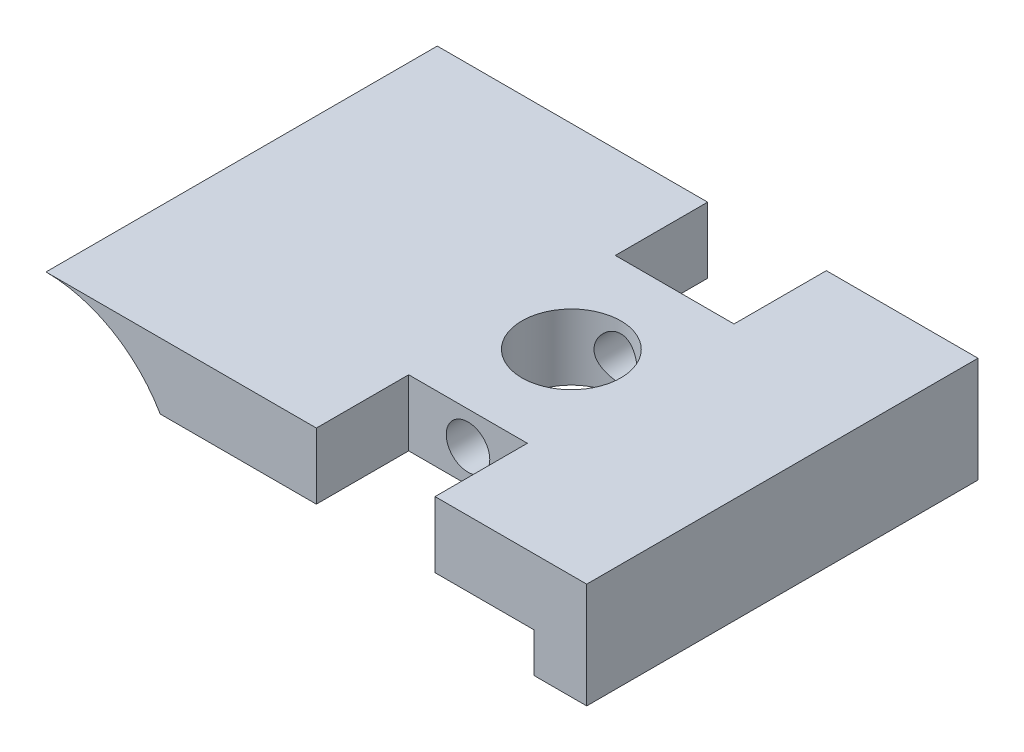
ISO-10303-21;
HEADER;
FILE_DESCRIPTION(('STEP AP214'),'2;1');
FILE_NAME('part.step','',(''),(''),'','','');
FILE_SCHEMA(('AUTOMOTIVE_DESIGN { 1 0 10303 214 1 1 1 1 }'));
ENDSEC;
DATA;
#1=APPLICATION_CONTEXT('core data for automotive mechanical design processes');
#2=APPLICATION_PROTOCOL_DEFINITION('international standard','automotive_design',2000,#1);
#3=PRODUCT_CONTEXT('',#1,'mechanical');
#4=PRODUCT('Part','Part','',(#3));
#5=PRODUCT_RELATED_PRODUCT_CATEGORY('part','',(#4));
#6=PRODUCT_DEFINITION_FORMATION('','',#4);
#7=PRODUCT_DEFINITION_CONTEXT('part definition',#1,'design');
#8=PRODUCT_DEFINITION('design','',#6,#7);
#9=PRODUCT_DEFINITION_SHAPE('','',#8);
#10=(LENGTH_UNIT() NAMED_UNIT(*) SI_UNIT(.MILLI.,.METRE.));
#11=(NAMED_UNIT(*) PLANE_ANGLE_UNIT() SI_UNIT($,.RADIAN.));
#12=(NAMED_UNIT(*) SI_UNIT($,.STERADIAN.) SOLID_ANGLE_UNIT());
#13=UNCERTAINTY_MEASURE_WITH_UNIT(LENGTH_MEASURE(1.E-05),#10,'distance_accuracy_value','');
#14=(GEOMETRIC_REPRESENTATION_CONTEXT(3) GLOBAL_UNCERTAINTY_ASSIGNED_CONTEXT((#13)) GLOBAL_UNIT_ASSIGNED_CONTEXT((#10,
#11,#12)) REPRESENTATION_CONTEXT('',''));
#15=CARTESIAN_POINT('',(0.,0.,0.));
#16=DIRECTION('',(0.,0.,1.));
#17=DIRECTION('',(1.,0.,0.));
#18=AXIS2_PLACEMENT_3D('',#15,#16,#17);
#19=CARTESIAN_POINT('',(4.5,0.,-14.836));
#20=DIRECTION('',(0.,0.,1.));
#21=DIRECTION('',(1.,0.,0.));
#22=AXIS2_PLACEMENT_3D('',#19,#20,#21);
#23=CYLINDRICAL_SURFACE('',#22,1.65);
#24=CARTESIAN_POINT('',(6.15,0.,-3.36749164809655));
#25=CARTESIAN_POINT('',(6.14999591948725,-0.0874743691332474,-3.36749607292385));
#26=CARTESIAN_POINT('',(6.14299960015496,-0.175092773934513,-3.37094939684784));
#27=CARTESIAN_POINT('',(6.11531716545798,-0.34775711686567,-3.38429832583538));
#28=CARTESIAN_POINT('',(6.09459592274657,-0.432795867086391,-3.39421046041475));
#29=CARTESIAN_POINT('',(6.04044870220548,-0.597493099250677,-3.41912171212208));
#30=CARTESIAN_POINT('',(6.00707857419381,-0.677173445386291,-3.43409843617774));
#31=CARTESIAN_POINT('',(5.92874832845569,-0.829783884986518,-3.46741736925901));
#32=CARTESIAN_POINT('',(5.88379002894349,-0.902715034980067,-3.48575905018412));
#33=CARTESIAN_POINT('',(5.78021734567749,-1.04487154765316,-3.52516638479344));
#34=CARTESIAN_POINT('',(5.72091990046757,-1.11357209474115,-3.5463309106205));
#35=CARTESIAN_POINT('',(5.59178303274802,-1.240446840094,-3.5881911575404));
#36=CARTESIAN_POINT('',(5.52193928529622,-1.2986166981996,-3.60888668227713));
#37=CARTESIAN_POINT('',(5.36946484491626,-1.4055670834385,-3.64870271327509));
#38=CARTESIAN_POINT('',(5.28637319615618,-1.45374252984987,-3.66769507829857));
#39=CARTESIAN_POINT('',(5.11227632392995,-1.53520034882065,-3.700736202455));
#40=CARTESIAN_POINT('',(5.02127502438019,-1.56849005628031,-3.71478739560396));
#41=CARTESIAN_POINT('',(4.8394662745173,-1.61728382118505,-3.73565913311448));
#42=CARTESIAN_POINT('',(4.74894589824285,-1.63369687425849,-3.74284752867496));
#43=CARTESIAN_POINT('',(4.56617018053507,-1.65122350001049,-3.75052967187645));
#44=CARTESIAN_POINT('',(4.47391564874559,-1.65234404312535,-3.75102646959465));
#45=CARTESIAN_POINT('',(4.29695735459994,-1.63969762210197,-3.74547519866295));
#46=CARTESIAN_POINT('',(4.2121653497081,-1.62693375012661,-3.739868091581));
#47=CARTESIAN_POINT('',(4.0460705321449,-1.58862001141632,-3.72336083389609));
#48=CARTESIAN_POINT('',(3.96476797823857,-1.56306919822084,-3.71246029148675));
#49=CARTESIAN_POINT('',(3.80645273442336,-1.49962622377596,-3.68619520386884));
#50=CARTESIAN_POINT('',(3.72952453920683,-1.46155151512837,-3.67076501619212));
#51=CARTESIAN_POINT('',(3.58294686925941,-1.37433410623967,-3.63691910801703));
#52=CARTESIAN_POINT('',(3.51330005270581,-1.32518738450649,-3.6185023034251));
#53=CARTESIAN_POINT('',(3.37753504589473,-1.2128170119971,-3.57882020061428));
#54=CARTESIAN_POINT('',(3.31210572269681,-1.14879890575555,-3.5574447595915));
#55=CARTESIAN_POINT('',(3.19259260075723,-1.01070787762529,-3.51528240579217));
#56=CARTESIAN_POINT('',(3.13851423294623,-0.936630170451263,-3.49449577883282));
#57=CARTESIAN_POINT('',(3.04117220405856,-0.776800460066403,-3.45502479534648));
#58=CARTESIAN_POINT('',(2.99843008891747,-0.690699088400845,-3.43645839327868));
#59=CARTESIAN_POINT('',(2.92834028609235,-0.511490455495734,-3.40497856582965));
#60=CARTESIAN_POINT('',(2.90098013157646,-0.41838893735563,-3.39206056440346));
#61=CARTESIAN_POINT('',(2.86429227707905,-0.234744535363264,-3.37451456223478));
#62=CARTESIAN_POINT('',(2.85383875555708,-0.144476988157731,-3.36937064835985));
#63=CARTESIAN_POINT('',(2.84792333452705,0.0366498278836367,-3.3664757487194));
#64=CARTESIAN_POINT('',(2.85245516573099,0.127508833402344,-3.36872167133214));
#65=CARTESIAN_POINT('',(2.87535174013094,0.300038323378435,-3.37981562096985));
#66=CARTESIAN_POINT('',(2.89265374352297,0.381886932345065,-3.3881559621082));
#67=CARTESIAN_POINT('',(2.93914744636585,0.541431160999625,-3.40982287754369));
#68=CARTESIAN_POINT('',(2.96834214737761,0.619125726657321,-3.42315071054923));
#69=CARTESIAN_POINT('',(3.03921629690324,0.77202746384104,-3.45400682275722));
#70=CARTESIAN_POINT('',(3.08139272921155,0.846970827739317,-3.47169539316014));
#71=CARTESIAN_POINT('',(3.1765572613445,0.989101543315069,-3.50907546279441));
#72=CARTESIAN_POINT('',(3.22955038819797,1.05628526590526,-3.5287678911715));
#73=CARTESIAN_POINT('',(3.35062358980462,1.1874847750961,-3.57013856276202));
#74=CARTESIAN_POINT('',(3.4196470398001,1.25062896923802,-3.59183160476859));
#75=CARTESIAN_POINT('',(3.56778238636593,1.36462621623266,-3.63309467060809));
#76=CARTESIAN_POINT('',(3.64689558402024,1.41547768147164,-3.65266442003673));
#77=CARTESIAN_POINT('',(3.81400673932618,1.50362813045693,-3.68771558350776));
#78=CARTESIAN_POINT('',(3.90206664806588,1.54082304607771,-3.70316536765515));
#79=CARTESIAN_POINT('',(4.08405684732281,1.59956776607056,-3.72798894821772));
#80=CARTESIAN_POINT('',(4.17798315090971,1.62112807306507,-3.73736682301229));
#81=CARTESIAN_POINT('',(4.3612978165453,1.64656089333973,-3.74847245839303));
#82=CARTESIAN_POINT('',(4.45048512527526,1.65165818539735,-3.75072963755332));
#83=CARTESIAN_POINT('',(4.62843486064658,1.64739798838614,-3.74885512685435));
#84=CARTESIAN_POINT('',(4.71719737386056,1.63804358240264,-3.74472479968784));
#85=CARTESIAN_POINT('',(4.88782932587363,1.60602123171462,-3.7308324127445));
#86=CARTESIAN_POINT('',(4.96983114363675,1.58394115377816,-3.72131934376771));
#87=CARTESIAN_POINT('',(5.12890956243099,1.52777362465028,-3.69776205916142));
#88=CARTESIAN_POINT('',(5.20598528433432,1.49368403723099,-3.68371703743449));
#89=CARTESIAN_POINT('',(5.3569304617613,1.41274147649752,-3.65162935021383));
#90=CARTESIAN_POINT('',(5.43049119711801,1.3653752637279,-3.63343300227536));
#91=CARTESIAN_POINT('',(5.56894266820481,1.2599369507724,-3.59513976322225));
#92=CARTESIAN_POINT('',(5.63382977719906,1.20186039623366,-3.57504208305736));
#93=CARTESIAN_POINT('',(5.75831260974056,1.0713970399496,-3.53324031823005));
#94=CARTESIAN_POINT('',(5.81711532685678,0.998252385431571,-3.51153178279635));
#95=CARTESIAN_POINT('',(5.92177534917193,0.842529476107367,-3.47047923678989));
#96=CARTESIAN_POINT('',(5.96762474174624,0.759945498298501,-3.45113667556083));
#97=CARTESIAN_POINT('',(6.0449162136947,0.587124299309065,-3.41723991894322));
#98=CARTESIAN_POINT('',(6.07632700235197,0.496870953906527,-3.40269614232787));
#99=CARTESIAN_POINT('',(6.12309555077018,0.311643517725808,-3.38064338773551));
#100=CARTESIAN_POINT('',(6.1385071714776,0.216686400884626,-3.3731108155642));
#101=CARTESIAN_POINT('',(6.14703108329939,0.100998496777638,-3.36894448238601));
#102=CARTESIAN_POINT('',(6.14814335262455,0.0808209970433201,-3.36840080987488));
#103=CARTESIAN_POINT('',(6.14962829144477,0.0404315640214751,-3.3676738770119));
#104=CARTESIAN_POINT('',(6.15000094320723,0.0202196299199993,-3.36749062530128));
#105=CARTESIAN_POINT('',(6.15,0.,-3.36749164809655));
#106=B_SPLINE_CURVE_WITH_KNOTS('',3,(#24,#25,#26,#27,#28,#29,#30,#31,#32,#33,#34,#35,#36,#37,
#38,#39,#40,#41,#42,#43,#44,#45,#46,#47,#48,#49,#50,#51,#52,#53,#54,#55,#56,#57,#58,#59,#60,#61,
#62,#63,#64,#65,#66,#67,#68,#69,#70,#71,#72,#73,#74,#75,#76,#77,#78,#79,#80,#81,#82,#83,#84,#85,
#86,#87,#88,#89,#90,#91,#92,#93,#94,#95,#96,#97,#98,#99,#100,#101,#102,#103,#104,#105),
.UNSPECIFIED.,.T.,.F.,(4,2,2,2,2,2,2,2,2,2,2,2,2,2,2,2,2,2,2,2,2,2,2,2,2,2,2,2,2,2,2,2,2,2,2,2,
2,2,2,2,4),(0.,0.262337992001349,0.52535001551118,0.787214015160153,1.04903695265106,
1.32739302247777,1.60586355517072,1.89807751150631,2.19014732125288,2.46549872058573,
2.74072460857159,2.9973112845901,3.25391695538524,3.51444216606865,3.77506215572741,
4.05582705551463,4.336725984226,4.62890596840992,4.92084880275994,5.1924046605751,
5.46384692437079,5.71493513596501,5.96608675823259,6.22839495294345,6.49082533337074,
6.77759301230099,7.06439770769602,7.35334470453729,7.64209741960136,7.90880391080322,
8.17545351143564,8.43067328899049,8.68593848747794,8.95289970595717,9.21997220307097,
9.50762420315226,9.79545153931286,10.0838997352209,10.371373694431,10.4320114560409,
10.4926506714452),.UNSPECIFIED.);
#107=CARTESIAN_POINT('',(6.15,0.,-3.36749164809655));
#108=VERTEX_POINT('',#107);
#109=EDGE_CURVE('E189',#108,#108,#106,.T.);
#110=ORIENTED_EDGE('',*,*,#109,.F.);
#111=EDGE_LOOP('',(#110));
#112=FACE_BOUND('',#111,.T.);
#113=CARTESIAN_POINT('',(4.5,0.,-7.835));
#114=DIRECTION('',(0.,0.,1.));
#115=DIRECTION('',(1.,0.,0.));
#116=AXIS2_PLACEMENT_3D('',#113,#114,#115);
#117=CIRCLE('',#116,1.65);
#118=CARTESIAN_POINT('',(6.15,0.,-7.835));
#119=VERTEX_POINT('',#118);
#120=EDGE_CURVE('E522',#119,#119,#117,.T.);
#121=ORIENTED_EDGE('',*,*,#120,.F.);
#122=EDGE_LOOP('',(#121));
#123=FACE_BOUND('',#122,.T.);
#124=ADVANCED_FACE('F45',(#112,#123),#23,.F.);
#125=CARTESIAN_POINT('',(4.5,-1.65,3.75));
#126=CARTESIAN_POINT('',(4.58794065243915,-1.64999603822561,3.74999677525689));
#127=CARTESIAN_POINT('',(4.67602118872723,-1.64292811014754,3.7468719189208));
#128=CARTESIAN_POINT('',(4.84965330491862,-1.61493414299233,3.734683166008));
#129=CARTESIAN_POINT('',(4.93519818666942,-1.59397431770864,3.72560479056562));
#130=CARTESIAN_POINT('',(5.10097235797528,-1.5391312845056,3.70247374212791));
#131=CARTESIAN_POINT('',(5.18121929706646,-1.505293822675,3.68843868963418));
#132=CARTESIAN_POINT('',(5.33481096834596,-1.42585820871192,3.65674015300381));
#133=CARTESIAN_POINT('',(5.40815735131847,-1.38026287916687,3.63907753990429));
#134=CARTESIAN_POINT('',(5.55000163649842,-1.27598104842036,3.60078615738986));
#135=CARTESIAN_POINT('',(5.61807366426439,-1.21675391782859,3.58005322837619));
#136=CARTESIAN_POINT('',(5.7436925761984,-1.08803679555134,3.53837779505836));
#137=CARTESIAN_POINT('',(5.80123331014303,-1.01854084946946,3.51743517577732));
#138=CARTESIAN_POINT('',(5.90737198125606,-0.866527492524001,3.47638120662905));
#139=CARTESIAN_POINT('',(5.95528386928225,-0.783497192018435,3.45638307676996));
#140=CARTESIAN_POINT('',(6.03627172599083,-0.609555260312115,3.4211597332649));
#141=CARTESIAN_POINT('',(6.0693561919984,-0.518648178890967,3.40593178742375));
#142=CARTESIAN_POINT('',(6.11794121689661,-0.33643127427299,3.3831135312385));
#143=CARTESIAN_POINT('',(6.13426566626132,-0.245387501455806,3.37516767353209));
#144=CARTESIAN_POINT('',(6.15143054751148,-0.0615333461945651,3.3668053594707));
#145=CARTESIAN_POINT('',(6.15228100759649,0.0312758530848443,3.36638402671406));
#146=CARTESIAN_POINT('',(6.13908919688509,0.207355873544221,3.3728210640382));
#147=CARTESIAN_POINT('',(6.1263414186449,0.290751689794496,3.37904671722602));
#148=CARTESIAN_POINT('',(6.08850520692875,0.454071225614268,3.39699646382114));
#149=CARTESIAN_POINT('',(6.06341407162607,0.533994180841888,3.40872176101459));
#150=CARTESIAN_POINT('',(6.00110649630305,0.690226926082279,3.43662073577462));
#151=CARTESIAN_POINT('',(5.96363227970244,0.766416489003947,3.45288773136686));
#152=CARTESIAN_POINT('',(5.87780710670809,0.911743878376032,3.48802159021638));
#153=CARTESIAN_POINT('',(5.82945161231713,0.980878745156236,3.50688953691531));
#154=CARTESIAN_POINT('',(5.71783776896922,1.1170679833526,3.54728261097474));
#155=CARTESIAN_POINT('',(5.65359849475329,1.18329659100235,3.56888963165699));
#156=CARTESIAN_POINT('',(5.51473808953318,1.30433611063186,3.61082599340459));
#157=CARTESIAN_POINT('',(5.44011395212262,1.3591437047246,3.63115496199219));
#158=CARTESIAN_POINT('',(5.2798454417349,1.45719190039968,3.66896451776513));
#159=CARTESIAN_POINT('',(5.19394811565676,1.50005943159355,3.68634771561838));
#160=CARTESIAN_POINT('',(5.01519989197508,1.57043908051859,3.71554130843415));
#161=CARTESIAN_POINT('',(4.92235333017466,1.59796068385571,3.72735514522372));
#162=CARTESIAN_POINT('',(4.73921022750968,1.63505304083377,3.74341295596741));
#163=CARTESIAN_POINT('',(4.64917854061997,1.64572966452197,3.74812228788192));
#164=CARTESIAN_POINT('',(4.46849247665595,1.65217171911425,3.75095455785044));
#165=CARTESIAN_POINT('',(4.37783831540075,1.64794208106068,3.74907967398628));
#166=CARTESIAN_POINT('',(4.20390665287527,1.62544881834208,3.73925037459651));
#167=CARTESIAN_POINT('',(4.12050230959726,1.60799437581934,3.73164663418775));
#168=CARTESIAN_POINT('',(3.95791706209694,1.56071027218963,3.71151728629914));
#169=CARTESIAN_POINT('',(3.87873667607145,1.53087909662229,3.69899107649862));
#170=CARTESIAN_POINT('',(3.72404079862632,1.45873229578337,3.66971134498956));
#171=CARTESIAN_POINT('',(3.64871703627142,1.41605581574277,3.65283800179973));
#172=CARTESIAN_POINT('',(3.50602810222664,1.31982329381418,3.61662102234894));
#173=CARTESIAN_POINT('',(3.43866640117435,1.26626253496257,3.5972763164179));
#174=CARTESIAN_POINT('',(3.30819611837274,1.14484038573232,3.55628214760162));
#175=CARTESIAN_POINT('',(3.24584598439285,1.07618271743489,3.53457144282308));
#176=CARTESIAN_POINT('',(3.13330445356359,0.92909720685713,3.49260064747062));
#177=CARTESIAN_POINT('',(3.08311709508679,0.85066613259215,3.47234104026915));
#178=CARTESIAN_POINT('',(2.9954030774859,0.68392159127596,3.43526035744153));
#179=CARTESIAN_POINT('',(2.95817723591055,0.595429542818635,3.4185241503665));
#180=CARTESIAN_POINT('',(2.89950438017547,0.412456963898667,3.39145640297362));
#181=CARTESIAN_POINT('',(2.87804232181517,0.317982236816919,3.38111875766089));
#182=CARTESIAN_POINT('',(2.85307874998712,0.134229339541117,3.36902436868046));
#183=CARTESIAN_POINT('',(2.84822601990919,0.0451768053067841,3.36662264808986));
#184=CARTESIAN_POINT('',(2.85292803694661,-0.132443324028022,3.36892598901368));
#185=CARTESIAN_POINT('',(2.86247987258739,-0.221011013494954,3.37362961438419));
#186=CARTESIAN_POINT('',(2.89454415171674,-0.389834130472385,3.38899632048544));
#187=CARTESIAN_POINT('',(2.91627535473376,-0.470274087988891,3.39929913530276));
#188=CARTESIAN_POINT('',(2.9712672768033,-0.626361280798594,3.42438089295876));
#189=CARTESIAN_POINT('',(3.00453131275969,-0.702007129869673,3.43916112337134));
#190=CARTESIAN_POINT('',(3.08406507679427,-0.851619735953305,3.47269356886383));
#191=CARTESIAN_POINT('',(3.13102681157857,-0.925174495154698,3.49163847278619));
#192=CARTESIAN_POINT('',(3.2357127896172,-1.06377992281056,3.53089238653571));
#193=CARTESIAN_POINT('',(3.29344141213049,-1.12882711256769,3.55120194925799));
#194=CARTESIAN_POINT('',(3.42382903951875,-1.25428003578287,3.59296880703805));
#195=CARTESIAN_POINT('',(3.49734015606778,-1.31382091586417,3.6143768693599));
#196=CARTESIAN_POINT('',(3.65406955877593,-1.41980560454866,3.65423468677977));
#197=CARTESIAN_POINT('',(3.73729223810856,-1.46624345307615,3.67268309400139));
#198=CARTESIAN_POINT('',(3.91023740744423,-1.54387701756614,3.70436408768263));
#199=CARTESIAN_POINT('',(3.99986734754799,-1.57525320509647,3.71765804406783));
#200=CARTESIAN_POINT('',(4.18371482188615,-1.62216171678277,3.73777368374933));
#201=CARTESIAN_POINT('',(4.27791736039553,-1.63774259010252,3.74461519501638));
#202=CARTESIAN_POINT('',(4.39387606102141,-1.64672172070879,3.7485588513459));
#203=CARTESIAN_POINT('',(4.41507632147087,-1.64794995964319,3.74909837906909));
#204=CARTESIAN_POINT('',(4.45751499929637,-1.64958958196251,3.74981934473969));
#205=CARTESIAN_POINT('',(4.47875341705226,-1.65000095717016,3.75000077910238));
#206=CARTESIAN_POINT('',(4.5,-1.65,3.75));
#207=B_SPLINE_CURVE_WITH_KNOTS('',3,(#125,#126,#127,#128,#129,#130,#131,#132,#133,#134,#135,
#136,#137,#138,#139,#140,#141,#142,#143,#144,#145,#146,#147,#148,#149,#150,#151,#152,#153,#154,
#155,#156,#157,#158,#159,#160,#161,#162,#163,#164,#165,#166,#167,#168,#169,#170,#171,#172,#173,
#174,#175,#176,#177,#178,#179,#180,#181,#182,#183,#184,#185,#186,#187,#188,#189,#190,#191,#192,
#193,#194,#195,#196,#197,#198,#199,#200,#201,#202,#203,#204,#205,#206),.UNSPECIFIED.,.T.,.F.,(4,
2,2,2,2,2,2,2,2,2,2,2,2,2,2,2,2,2,2,2,2,2,2,2,2,2,2,2,2,2,2,2,2,2,2,2,2,2,2,2,4),(0.,
0.263734510147988,0.52811280905045,0.791560575603075,1.05494515780487,1.33150079465859,
1.60821742685178,1.90051649596436,2.19264783893791,2.46960925800041,2.74639118079142,
2.99899429642278,3.25165272874969,3.50994222706956,3.76833964437948,4.05135561937526,
4.33445369828947,4.62559874662744,4.91656363268483,5.18748705235547,5.45832085804592,
5.71380105020368,5.96931251303604,6.23280504553125,6.49641201330446,6.78088013255853,
7.06544257396593,7.35622693243307,7.64673341835486,7.91295937269032,8.17913152420861,
8.42991502344918,8.68077070926696,8.94756356427704,9.21446517058845,9.50405959505639,
9.79378553355286,10.0799474542432,10.3652271238324,10.4289451074685,10.4926637289549),.UNSPECIFIED.);
#208=CARTESIAN_POINT('',(4.5,-1.65,3.75));
#209=VERTEX_POINT('',#208);
#210=EDGE_CURVE('E198',#209,#209,#207,.T.);
#211=ORIENTED_EDGE('',*,*,#210,.F.);
#212=EDGE_LOOP('',(#211));
#213=FACE_BOUND('',#212,.T.);
#214=CARTESIAN_POINT('',(4.5,0.,7.835));
#215=DIRECTION('',(0.,0.,1.));
#216=DIRECTION('',(1.,0.,0.));
#217=AXIS2_PLACEMENT_3D('',#214,#215,#216);
#218=CIRCLE('',#217,1.65);
#219=CARTESIAN_POINT('',(6.15,0.,7.835));
#220=VERTEX_POINT('',#219);
#221=EDGE_CURVE('E482',#220,#220,#218,.T.);
#222=ORIENTED_EDGE('',*,*,#221,.T.);
#223=EDGE_LOOP('',(#222));
#224=FACE_BOUND('',#223,.T.);
#225=ADVANCED_FACE('F215',(#213,#224),#23,.F.);
#226=CARTESIAN_POINT('',(-20.5,2.50000000000001,14.835));
#227=DIRECTION('',(0.,-1.,0.));
#228=DIRECTION('',(1.,0.,0.));
#229=AXIS2_PLACEMENT_3D('',#226,#227,#228);
#230=PLANE('',#229);
#231=CARTESIAN_POINT('',(4.5,2.5,0.));
#232=DIRECTION('',(0.,1.,0.));
#233=DIRECTION('',(0.,0.,1.));
#234=AXIS2_PLACEMENT_3D('',#231,#232,#233);
#235=CIRCLE('',#234,3.75);
#236=CARTESIAN_POINT('',(4.5,2.5,3.75));
#237=VERTEX_POINT('',#236);
#238=EDGE_CURVE('E181',#237,#237,#235,.T.);
#239=ORIENTED_EDGE('',*,*,#238,.F.);
#240=EDGE_LOOP('',(#239));
#241=FACE_BOUND('',#240,.T.);
#242=DIRECTION('',(0.,0.,-1.));
#243=VECTOR('',#242,1.);
#244=CARTESIAN_POINT('',(0.,2.5,-7.835));
#245=LINE('',#244,#243);
#246=CARTESIAN_POINT('',(0.,2.5,-7.835));
#247=VERTEX_POINT('',#246);
#248=CARTESIAN_POINT('',(0.,2.5,-14.835));
#249=VERTEX_POINT('',#248);
#250=EDGE_CURVE('E255',#247,#249,#245,.T.);
#251=ORIENTED_EDGE('',*,*,#250,.T.);
#252=DIRECTION('',(-1.,0.,0.));
#253=VECTOR('',#252,1.);
#254=CARTESIAN_POINT('',(-20.5,2.50000000000001,-14.835));
#255=LINE('',#254,#253);
#256=CARTESIAN_POINT('',(-20.5,2.50000000000001,-14.835));
#257=VERTEX_POINT('',#256);
#258=EDGE_CURVE('E258',#249,#257,#255,.T.);
#259=ORIENTED_EDGE('',*,*,#258,.T.);
#260=DIRECTION('',(0.,0.,-1.));
#261=VECTOR('',#260,1.);
#262=CARTESIAN_POINT('',(-20.5,2.50000000000001,14.835));
#263=LINE('',#262,#261);
#264=CARTESIAN_POINT('',(-20.5,2.50000000000001,14.835));
#265=VERTEX_POINT('',#264);
#266=EDGE_CURVE('E54',#265,#257,#263,.T.);
#267=ORIENTED_EDGE('',*,*,#266,.F.);
#268=DIRECTION('',(-1.,0.,0.));
#269=VECTOR('',#268,1.);
#270=CARTESIAN_POINT('',(-20.5,2.50000000000001,14.835));
#271=LINE('',#270,#269);
#272=CARTESIAN_POINT('',(0.,2.5,14.835));
#273=VERTEX_POINT('',#272);
#274=EDGE_CURVE('E301',#273,#265,#271,.T.);
#275=ORIENTED_EDGE('',*,*,#274,.F.);
#276=DIRECTION('',(0.,0.,1.));
#277=VECTOR('',#276,1.);
#278=CARTESIAN_POINT('',(0.,2.5,7.835));
#279=LINE('',#278,#277);
#280=CARTESIAN_POINT('',(0.,2.5,7.835));
#281=VERTEX_POINT('',#280);
#282=EDGE_CURVE('E280',#281,#273,#279,.T.);
#283=ORIENTED_EDGE('',*,*,#282,.F.);
#284=DIRECTION('',(-1.,0.,0.));
#285=VECTOR('',#284,1.);
#286=CARTESIAN_POINT('',(9.,2.49999999999999,7.835));
#287=LINE('',#286,#285);
#288=CARTESIAN_POINT('',(9.,2.49999999999999,7.835));
#289=VERTEX_POINT('',#288);
#290=EDGE_CURVE('E487',#289,#281,#287,.T.);
#291=ORIENTED_EDGE('',*,*,#290,.F.);
#292=DIRECTION('',(0.,0.,1.));
#293=VECTOR('',#292,1.);
#294=CARTESIAN_POINT('',(9.,2.49999999999999,7.835));
#295=LINE('',#294,#293);
#296=CARTESIAN_POINT('',(9.,2.49999999999999,14.835));
#297=VERTEX_POINT('',#296);
#298=EDGE_CURVE('E490',#289,#297,#295,.T.);
#299=ORIENTED_EDGE('',*,*,#298,.T.);
#300=CARTESIAN_POINT('',(20.5,2.49999999999999,14.835));
#301=VERTEX_POINT('',#300);
#302=EDGE_CURVE('E306',#301,#297,#271,.T.);
#303=ORIENTED_EDGE('',*,*,#302,.F.);
#304=DIRECTION('',(0.,0.,-1.));
#305=VECTOR('',#304,1.);
#306=CARTESIAN_POINT('',(20.5,2.49999999999999,14.835));
#307=LINE('',#306,#305);
#308=CARTESIAN_POINT('',(20.5,2.49999999999999,-14.835));
#309=VERTEX_POINT('',#308);
#310=EDGE_CURVE('E11',#301,#309,#307,.T.);
#311=ORIENTED_EDGE('',*,*,#310,.T.);
#312=CARTESIAN_POINT('',(9.,2.5,-14.835));
#313=VERTEX_POINT('',#312);
#314=EDGE_CURVE('E275',#309,#313,#255,.T.);
#315=ORIENTED_EDGE('',*,*,#314,.T.);
#316=DIRECTION('',(0.,0.,-1.));
#317=VECTOR('',#316,1.);
#318=CARTESIAN_POINT('',(9.,2.49999999999999,-7.835));
#319=LINE('',#318,#317);
#320=CARTESIAN_POINT('',(9.,2.49999999999999,-7.835));
#321=VERTEX_POINT('',#320);
#322=EDGE_CURVE('E69',#321,#313,#319,.T.);
#323=ORIENTED_EDGE('',*,*,#322,.F.);
#324=DIRECTION('',(-1.,0.,0.));
#325=VECTOR('',#324,1.);
#326=CARTESIAN_POINT('',(9.,2.49999999999999,-7.835));
#327=LINE('',#326,#325);
#328=EDGE_CURVE('E261',#321,#247,#327,.T.);
#329=ORIENTED_EDGE('',*,*,#328,.T.);
#330=EDGE_LOOP('',(#251,#259,#267,#275,#283,#291,#299,#303,#311,#315,#323,#329));
#331=FACE_BOUND('',#330,.T.);
#332=ADVANCED_FACE('F222',(#241,#331),#230,.F.);
#333=CARTESIAN_POINT('',(-11.8397459621556,-2.50000000000001,14.835));
#334=DIRECTION('',(0.,1.,0.));
#335=DIRECTION('',(0.,0.,1.));
#336=AXIS2_PLACEMENT_3D('',#333,#334,#335);
#337=PLANE('',#336);
#338=CARTESIAN_POINT('',(4.5,-2.50000000000001,0.));
#339=DIRECTION('',(0.,1.,0.));
#340=DIRECTION('',(0.,0.,1.));
#341=AXIS2_PLACEMENT_3D('',#338,#339,#340);
#342=CIRCLE('',#341,3.75);
#343=CARTESIAN_POINT('',(4.5,-2.50000000000001,3.75));
#344=VERTEX_POINT('',#343);
#345=EDGE_CURVE('E185',#344,#344,#342,.F.);
#346=ORIENTED_EDGE('',*,*,#345,.F.);
#347=EDGE_LOOP('',(#346));
#348=FACE_BOUND('',#347,.T.);
#349=DIRECTION('',(1.,0.,0.));
#350=VECTOR('',#349,1.);
#351=CARTESIAN_POINT('',(-11.8397459621556,-2.50000000000001,-14.835));
#352=LINE('',#351,#350);
#353=CARTESIAN_POINT('',(9.,-2.49999999999999,-14.835));
#354=VERTEX_POINT('',#353);
#355=CARTESIAN_POINT('',(16.5,-2.50000000000001,-14.835));
#356=VERTEX_POINT('',#355);
#357=EDGE_CURVE('E286',#354,#356,#352,.T.);
#358=ORIENTED_EDGE('',*,*,#357,.T.);
#359=DIRECTION('',(0.,0.,1.));
#360=VECTOR('',#359,1.);
#361=CARTESIAN_POINT('',(16.5,-2.50000000000001,-19.835));
#362=LINE('',#361,#360);
#363=CARTESIAN_POINT('',(16.5,-2.50000000000001,14.835));
#364=VERTEX_POINT('',#363);
#365=EDGE_CURVE('E169',#356,#364,#362,.T.);
#366=ORIENTED_EDGE('',*,*,#365,.T.);
#367=DIRECTION('',(1.,0.,0.));
#368=VECTOR('',#367,1.);
#369=CARTESIAN_POINT('',(-11.8397459621556,-2.50000000000001,14.835));
#370=LINE('',#369,#368);
#371=CARTESIAN_POINT('',(9.,-2.50000000000001,14.835));
#372=VERTEX_POINT('',#371);
#373=EDGE_CURVE('E316',#372,#364,#370,.T.);
#374=ORIENTED_EDGE('',*,*,#373,.F.);
#375=DIRECTION('',(0.,0.,1.));
#376=VECTOR('',#375,1.);
#377=CARTESIAN_POINT('',(9.,-2.49999999999999,7.835));
#378=LINE('',#377,#376);
#379=CARTESIAN_POINT('',(9.,-2.49999999999999,7.835));
#380=VERTEX_POINT('',#379);
#381=EDGE_CURVE('E328',#380,#372,#378,.T.);
#382=ORIENTED_EDGE('',*,*,#381,.F.);
#383=DIRECTION('',(1.,0.,0.));
#384=VECTOR('',#383,1.);
#385=CARTESIAN_POINT('',(9.,-2.49999999999999,7.835));
#386=LINE('',#385,#384);
#387=CARTESIAN_POINT('',(0.,-2.5,7.835));
#388=VERTEX_POINT('',#387);
#389=EDGE_CURVE('E485',#388,#380,#386,.T.);
#390=ORIENTED_EDGE('',*,*,#389,.F.);
#391=DIRECTION('',(0.,0.,1.));
#392=VECTOR('',#391,1.);
#393=CARTESIAN_POINT('',(0.,-2.5,7.835));
#394=LINE('',#393,#392);
#395=CARTESIAN_POINT('',(0.,-2.5,14.835));
#396=VERTEX_POINT('',#395);
#397=EDGE_CURVE('E479',#388,#396,#394,.T.);
#398=ORIENTED_EDGE('',*,*,#397,.T.);
#399=CARTESIAN_POINT('',(-11.8397459621556,-2.50000000000001,14.835));
#400=VERTEX_POINT('',#399);
#401=EDGE_CURVE('E294',#400,#396,#370,.T.);
#402=ORIENTED_EDGE('',*,*,#401,.F.);
#403=DIRECTION('',(0.,0.,-1.));
#404=VECTOR('',#403,1.);
#405=CARTESIAN_POINT('',(-11.8397459621556,-2.50000000000001,14.835));
#406=LINE('',#405,#404);
#407=CARTESIAN_POINT('',(-11.8397459621556,-2.50000000000001,-14.835));
#408=VERTEX_POINT('',#407);
#409=EDGE_CURVE('E291',#400,#408,#406,.T.);
#410=ORIENTED_EDGE('',*,*,#409,.T.);
#411=CARTESIAN_POINT('',(0.,-2.5,-14.835));
#412=VERTEX_POINT('',#411);
#413=EDGE_CURVE('E287',#408,#412,#352,.T.);
#414=ORIENTED_EDGE('',*,*,#413,.T.);
#415=DIRECTION('',(0.,0.,-1.));
#416=VECTOR('',#415,1.);
#417=CARTESIAN_POINT('',(0.,-2.5,-7.835));
#418=LINE('',#417,#416);
#419=CARTESIAN_POINT('',(0.,-2.5,-7.835));
#420=VERTEX_POINT('',#419);
#421=EDGE_CURVE('E512',#420,#412,#418,.T.);
#422=ORIENTED_EDGE('',*,*,#421,.F.);
#423=DIRECTION('',(1.,0.,0.));
#424=VECTOR('',#423,1.);
#425=CARTESIAN_POINT('',(9.,-2.49999999999999,-7.835));
#426=LINE('',#425,#424);
#427=CARTESIAN_POINT('',(9.,-2.49999999999999,-7.835));
#428=VERTEX_POINT('',#427);
#429=EDGE_CURVE('E266',#420,#428,#426,.T.);
#430=ORIENTED_EDGE('',*,*,#429,.T.);
#431=DIRECTION('',(0.,0.,-1.));
#432=VECTOR('',#431,1.);
#433=CARTESIAN_POINT('',(9.,-2.49999999999999,-7.835));
#434=LINE('',#433,#432);
#435=EDGE_CURVE('E331',#428,#354,#434,.T.);
#436=ORIENTED_EDGE('',*,*,#435,.T.);
#437=EDGE_LOOP('',(#358,#366,#374,#382,#390,#398,#402,#410,#414,#422,#430,#436));
#438=FACE_BOUND('',#437,.T.);
#439=ADVANCED_FACE('F239',(#348,#438),#337,.F.);
#440=CARTESIAN_POINT('',(-20.5,-7.49999999999999,-14.835));
#441=DIRECTION('',(0.,0.,-1.));
#442=DIRECTION('',(-1.,0.,0.));
#443=AXIS2_PLACEMENT_3D('',#440,#441,#442);
#444=PLANE('',#443);
#445=ORIENTED_EDGE('',*,*,#258,.F.);
#446=DIRECTION('',(0.,-1.,0.));
#447=VECTOR('',#446,1.);
#448=CARTESIAN_POINT('',(0.,-2.5,-14.835));
#449=LINE('',#448,#447);
#450=EDGE_CURVE('E271',#249,#412,#449,.T.);
#451=ORIENTED_EDGE('',*,*,#450,.T.);
#452=ORIENTED_EDGE('',*,*,#413,.F.);
#453=CARTESIAN_POINT('',(-20.5,-7.49999999999999,-14.835));
#454=DIRECTION('',(0.,0.,-1.));
#455=DIRECTION('',(-1.,0.,0.));
#456=AXIS2_PLACEMENT_3D('',#453,#454,#455);
#457=CIRCLE('',#456,10.);
#458=EDGE_CURVE('E273',#257,#408,#457,.T.);
#459=ORIENTED_EDGE('',*,*,#458,.F.);
#460=EDGE_LOOP('',(#445,#451,#452,#459));
#461=FACE_BOUND('',#460,.T.);
#462=ADVANCED_FACE('F236',(#461),#444,.T.);
#463=ORIENTED_EDGE('',*,*,#357,.F.);
#464=DIRECTION('',(0.,1.,0.));
#465=VECTOR('',#464,1.);
#466=CARTESIAN_POINT('',(9.,-2.49999999999999,-14.835));
#467=LINE('',#466,#465);
#468=EDGE_CURVE('E333',#354,#313,#467,.T.);
#469=ORIENTED_EDGE('',*,*,#468,.T.);
#470=ORIENTED_EDGE('',*,*,#314,.F.);
#471=DIRECTION('',(0.,1.,0.));
#472=VECTOR('',#471,1.);
#473=CARTESIAN_POINT('',(20.5,-2.50000000000001,-14.835));
#474=LINE('',#473,#472);
#475=CARTESIAN_POINT('',(20.5,-5.50000000000001,-14.835));
#476=VERTEX_POINT('',#475);
#477=EDGE_CURVE('E154',#476,#309,#474,.T.);
#478=ORIENTED_EDGE('',*,*,#477,.F.);
#479=DIRECTION('',(1.,0.,0.));
#480=VECTOR('',#479,1.);
#481=CARTESIAN_POINT('',(20.5,-5.50000000000001,-14.835));
#482=LINE('',#481,#480);
#483=CARTESIAN_POINT('',(16.5,-5.50000000000001,-14.835));
#484=VERTEX_POINT('',#483);
#485=EDGE_CURVE('E147',#484,#476,#482,.T.);
#486=ORIENTED_EDGE('',*,*,#485,.F.);
#487=DIRECTION('',(0.,-1.,0.));
#488=VECTOR('',#487,1.);
#489=CARTESIAN_POINT('',(16.5,-5.50000000000001,-14.835));
#490=LINE('',#489,#488);
#491=EDGE_CURVE('E152',#356,#484,#490,.T.);
#492=ORIENTED_EDGE('',*,*,#491,.F.);
#493=EDGE_LOOP('',(#463,#469,#470,#478,#486,#492));
#494=FACE_BOUND('',#493,.T.);
#495=ADVANCED_FACE('F150',(#494),#444,.T.);
#496=CARTESIAN_POINT('',(-20.5,-7.49999999999999,14.835));
#497=DIRECTION('',(0.,0.,-1.));
#498=DIRECTION('',(-1.,0.,0.));
#499=AXIS2_PLACEMENT_3D('',#496,#497,#498);
#500=PLANE('',#499);
#501=ORIENTED_EDGE('',*,*,#401,.T.);
#502=DIRECTION('',(0.,-1.,0.));
#503=VECTOR('',#502,1.);
#504=CARTESIAN_POINT('',(0.,-2.5,14.835));
#505=LINE('',#504,#503);
#506=EDGE_CURVE('E477',#273,#396,#505,.T.);
#507=ORIENTED_EDGE('',*,*,#506,.F.);
#508=ORIENTED_EDGE('',*,*,#274,.T.);
#509=CARTESIAN_POINT('',(-20.5,-7.49999999999999,14.835));
#510=DIRECTION('',(0.,0.,-1.));
#511=DIRECTION('',(-1.,0.,0.));
#512=AXIS2_PLACEMENT_3D('',#509,#510,#511);
#513=CIRCLE('',#512,10.);
#514=EDGE_CURVE('E298',#265,#400,#513,.T.);
#515=ORIENTED_EDGE('',*,*,#514,.T.);
#516=EDGE_LOOP('',(#501,#507,#508,#515));
#517=FACE_BOUND('',#516,.T.);
#518=ADVANCED_FACE('F235',(#517),#500,.F.);
#519=CARTESIAN_POINT('',(20.5,-2.50000000000001,14.835));
#520=DIRECTION('',(-1.,0.,0.));
#521=DIRECTION('',(0.,0.,1.));
#522=AXIS2_PLACEMENT_3D('',#519,#520,#521);
#523=PLANE('',#522);
#524=ORIENTED_EDGE('',*,*,#477,.T.);
#525=ORIENTED_EDGE('',*,*,#310,.F.);
#526=DIRECTION('',(0.,1.,0.));
#527=VECTOR('',#526,1.);
#528=CARTESIAN_POINT('',(20.5,-2.50000000000001,14.835));
#529=LINE('',#528,#527);
#530=CARTESIAN_POINT('',(20.5,-5.50000000000001,14.835));
#531=VERTEX_POINT('',#530);
#532=EDGE_CURVE('E290',#531,#301,#529,.T.);
#533=ORIENTED_EDGE('',*,*,#532,.F.);
#534=DIRECTION('',(0.,0.,1.));
#535=VECTOR('',#534,1.);
#536=CARTESIAN_POINT('',(20.5,-5.50000000000001,-19.835));
#537=LINE('',#536,#535);
#538=EDGE_CURVE('E159',#476,#531,#537,.T.);
#539=ORIENTED_EDGE('',*,*,#538,.F.);
#540=EDGE_LOOP('',(#524,#525,#533,#539));
#541=FACE_BOUND('',#540,.T.);
#542=ADVANCED_FACE('F47',(#541),#523,.F.);
#543=CARTESIAN_POINT('',(-20.5,-7.49999999999999,14.835));
#544=DIRECTION('',(0.,0.,-1.));
#545=DIRECTION('',(-1.,0.,0.));
#546=AXIS2_PLACEMENT_3D('',#543,#544,#545);
#547=CYLINDRICAL_SURFACE('',#546,10.);
#548=ORIENTED_EDGE('',*,*,#458,.T.);
#549=ORIENTED_EDGE('',*,*,#409,.F.);
#550=ORIENTED_EDGE('',*,*,#514,.F.);
#551=ORIENTED_EDGE('',*,*,#266,.T.);
#552=EDGE_LOOP('',(#548,#549,#550,#551));
#553=FACE_BOUND('',#552,.T.);
#554=ADVANCED_FACE('F233',(#553),#547,.F.);
#555=ORIENTED_EDGE('',*,*,#302,.T.);
#556=DIRECTION('',(0.,1.,0.));
#557=VECTOR('',#556,1.);
#558=CARTESIAN_POINT('',(9.,-2.49999999999999,14.835));
#559=LINE('',#558,#557);
#560=EDGE_CURVE('E324',#372,#297,#559,.T.);
#561=ORIENTED_EDGE('',*,*,#560,.F.);
#562=ORIENTED_EDGE('',*,*,#373,.T.);
#563=DIRECTION('',(0.,-1.,0.));
#564=VECTOR('',#563,1.);
#565=CARTESIAN_POINT('',(16.5,-5.50000000000001,14.835));
#566=LINE('',#565,#564);
#567=CARTESIAN_POINT('',(16.5,-5.50000000000001,14.835));
#568=VERTEX_POINT('',#567);
#569=EDGE_CURVE('E61',#364,#568,#566,.T.);
#570=ORIENTED_EDGE('',*,*,#569,.T.);
#571=DIRECTION('',(1.,0.,0.));
#572=VECTOR('',#571,1.);
#573=CARTESIAN_POINT('',(20.5,-5.50000000000001,14.835));
#574=LINE('',#573,#572);
#575=EDGE_CURVE('E165',#568,#531,#574,.T.);
#576=ORIENTED_EDGE('',*,*,#575,.T.);
#577=ORIENTED_EDGE('',*,*,#532,.T.);
#578=EDGE_LOOP('',(#555,#561,#562,#570,#576,#577));
#579=FACE_BOUND('',#578,.T.);
#580=ADVANCED_FACE('F230',(#579),#500,.F.);
#581=CARTESIAN_POINT('',(0.,-2.5,7.835));
#582=DIRECTION('',(-1.,0.,0.));
#583=DIRECTION('',(0.,0.,1.));
#584=AXIS2_PLACEMENT_3D('',#581,#582,#583);
#585=PLANE('',#584);
#586=ORIENTED_EDGE('',*,*,#506,.T.);
#587=ORIENTED_EDGE('',*,*,#397,.F.);
#588=DIRECTION('',(0.,-1.,0.));
#589=VECTOR('',#588,1.);
#590=CARTESIAN_POINT('',(0.,-2.5,7.835));
#591=LINE('',#590,#589);
#592=EDGE_CURVE('E501',#281,#388,#591,.T.);
#593=ORIENTED_EDGE('',*,*,#592,.F.);
#594=ORIENTED_EDGE('',*,*,#282,.T.);
#595=EDGE_LOOP('',(#586,#587,#593,#594));
#596=FACE_BOUND('',#595,.T.);
#597=ADVANCED_FACE('F228',(#596),#585,.F.);
#598=CARTESIAN_POINT('',(9.,-2.49999999999999,7.835));
#599=DIRECTION('',(1.,0.,0.));
#600=DIRECTION('',(0.,0.,-1.));
#601=AXIS2_PLACEMENT_3D('',#598,#599,#600);
#602=PLANE('',#601);
#603=ORIENTED_EDGE('',*,*,#560,.T.);
#604=ORIENTED_EDGE('',*,*,#298,.F.);
#605=DIRECTION('',(0.,1.,0.));
#606=VECTOR('',#605,1.);
#607=CARTESIAN_POINT('',(9.,-2.49999999999999,7.835));
#608=LINE('',#607,#606);
#609=EDGE_CURVE('E493',#380,#289,#608,.T.);
#610=ORIENTED_EDGE('',*,*,#609,.F.);
#611=ORIENTED_EDGE('',*,*,#381,.T.);
#612=EDGE_LOOP('',(#603,#604,#610,#611));
#613=FACE_BOUND('',#612,.T.);
#614=ADVANCED_FACE('F423',(#613),#602,.F.);
#615=CARTESIAN_POINT('',(0.,0.,7.835));
#616=DIRECTION('',(0.,0.,1.));
#617=DIRECTION('',(1.,0.,0.));
#618=AXIS2_PLACEMENT_3D('',#615,#616,#617);
#619=PLANE('',#618);
#620=ORIENTED_EDGE('',*,*,#221,.F.);
#621=EDGE_LOOP('',(#620));
#622=FACE_BOUND('',#621,.T.);
#623=ORIENTED_EDGE('',*,*,#592,.T.);
#624=ORIENTED_EDGE('',*,*,#389,.T.);
#625=ORIENTED_EDGE('',*,*,#609,.T.);
#626=ORIENTED_EDGE('',*,*,#290,.T.);
#627=EDGE_LOOP('',(#623,#624,#625,#626));
#628=FACE_BOUND('',#627,.T.);
#629=ADVANCED_FACE('F394',(#622,#628),#619,.T.);
#630=CARTESIAN_POINT('',(0.,0.,-7.835));
#631=DIRECTION('',(0.,0.,-1.));
#632=DIRECTION('',(1.,0.,0.));
#633=AXIS2_PLACEMENT_3D('',#630,#631,#632);
#634=PLANE('',#633);
#635=DIRECTION('',(0.,-1.,0.));
#636=VECTOR('',#635,1.);
#637=CARTESIAN_POINT('',(0.,-2.5,-7.835));
#638=LINE('',#637,#636);
#639=EDGE_CURVE('E335',#247,#420,#638,.T.);
#640=ORIENTED_EDGE('',*,*,#639,.F.);
#641=ORIENTED_EDGE('',*,*,#328,.F.);
#642=DIRECTION('',(0.,1.,0.));
#643=VECTOR('',#642,1.);
#644=CARTESIAN_POINT('',(9.,-2.49999999999999,-7.835));
#645=LINE('',#644,#643);
#646=EDGE_CURVE('E525',#428,#321,#645,.T.);
#647=ORIENTED_EDGE('',*,*,#646,.F.);
#648=ORIENTED_EDGE('',*,*,#429,.F.);
#649=EDGE_LOOP('',(#640,#641,#647,#648));
#650=FACE_BOUND('',#649,.T.);
#651=ORIENTED_EDGE('',*,*,#120,.T.);
#652=EDGE_LOOP('',(#651));
#653=FACE_BOUND('',#652,.T.);
#654=ADVANCED_FACE('F385',(#650,#653),#634,.T.);
#655=CARTESIAN_POINT('',(0.,-2.5,-7.835));
#656=DIRECTION('',(1.,0.,0.));
#657=DIRECTION('',(0.,0.,-1.));
#658=AXIS2_PLACEMENT_3D('',#655,#656,#657);
#659=PLANE('',#658);
#660=ORIENTED_EDGE('',*,*,#450,.F.);
#661=ORIENTED_EDGE('',*,*,#250,.F.);
#662=ORIENTED_EDGE('',*,*,#639,.T.);
#663=ORIENTED_EDGE('',*,*,#421,.T.);
#664=EDGE_LOOP('',(#660,#661,#662,#663));
#665=FACE_BOUND('',#664,.T.);
#666=ADVANCED_FACE('F376',(#665),#659,.T.);
#667=CARTESIAN_POINT('',(9.,-2.49999999999999,-7.835));
#668=DIRECTION('',(-1.,0.,0.));
#669=DIRECTION('',(0.,0.,1.));
#670=AXIS2_PLACEMENT_3D('',#667,#668,#669);
#671=PLANE('',#670);
#672=ORIENTED_EDGE('',*,*,#468,.F.);
#673=ORIENTED_EDGE('',*,*,#435,.F.);
#674=ORIENTED_EDGE('',*,*,#646,.T.);
#675=ORIENTED_EDGE('',*,*,#322,.T.);
#676=EDGE_LOOP('',(#672,#673,#674,#675));
#677=FACE_BOUND('',#676,.T.);
#678=ADVANCED_FACE('F360',(#677),#671,.T.);
#679=CARTESIAN_POINT('',(4.5,-2.50100000000001,0.));
#680=DIRECTION('',(0.,1.,0.));
#681=DIRECTION('',(0.,0.,1.));
#682=AXIS2_PLACEMENT_3D('',#679,#680,#681);
#683=CYLINDRICAL_SURFACE('',#682,3.75);
#684=ORIENTED_EDGE('',*,*,#238,.T.);
#685=EDGE_LOOP('',(#684));
#686=FACE_BOUND('',#685,.T.);
#687=ORIENTED_EDGE('',*,*,#345,.T.);
#688=EDGE_LOOP('',(#687));
#689=FACE_BOUND('',#688,.T.);
#690=ORIENTED_EDGE('',*,*,#109,.T.);
#691=EDGE_LOOP('',(#690));
#692=FACE_BOUND('',#691,.T.);
#693=ORIENTED_EDGE('',*,*,#210,.T.);
#694=EDGE_LOOP('',(#693));
#695=FACE_BOUND('',#694,.T.);
#696=ADVANCED_FACE('F203',(#686,#689,#692,#695),#683,.F.);
#697=CARTESIAN_POINT('',(16.5,-5.50000000000001,-19.835));
#698=DIRECTION('',(-1.,0.,0.));
#699=DIRECTION('',(0.,0.,1.));
#700=AXIS2_PLACEMENT_3D('',#697,#698,#699);
#701=PLANE('',#700);
#702=ORIENTED_EDGE('',*,*,#365,.F.);
#703=ORIENTED_EDGE('',*,*,#491,.T.);
#704=DIRECTION('',(0.,0.,1.));
#705=VECTOR('',#704,1.);
#706=CARTESIAN_POINT('',(16.5,-5.50000000000001,-19.835));
#707=LINE('',#706,#705);
#708=EDGE_CURVE('E160',#484,#568,#707,.T.);
#709=ORIENTED_EDGE('',*,*,#708,.T.);
#710=ORIENTED_EDGE('',*,*,#569,.F.);
#711=EDGE_LOOP('',(#702,#703,#709,#710));
#712=FACE_BOUND('',#711,.T.);
#713=ADVANCED_FACE('F168',(#712),#701,.T.);
#714=CARTESIAN_POINT('',(20.5,-5.50000000000001,-19.835));
#715=DIRECTION('',(0.,-1.,0.));
#716=DIRECTION('',(1.,0.,0.));
#717=AXIS2_PLACEMENT_3D('',#714,#715,#716);
#718=PLANE('',#717);
#719=ORIENTED_EDGE('',*,*,#708,.F.);
#720=ORIENTED_EDGE('',*,*,#485,.T.);
#721=ORIENTED_EDGE('',*,*,#538,.T.);
#722=ORIENTED_EDGE('',*,*,#575,.F.);
#723=EDGE_LOOP('',(#719,#720,#721,#722));
#724=FACE_BOUND('',#723,.T.);
#725=ADVANCED_FACE('F163',(#724),#718,.T.);
#726=CLOSED_SHELL('',(#124,#225,#332,#439,#462,#495,#518,#542,#554,#580,#597,#614,#629,#654,
#666,#678,#696,#713,#725));
#727=MANIFOLD_SOLID_BREP('B2',#726);
#728=ADVANCED_BREP_SHAPE_REPRESENTATION('',(#18,#727),#14);
#729=SHAPE_DEFINITION_REPRESENTATION(#9,#728);
ENDSEC;
END-ISO-10303-21;
